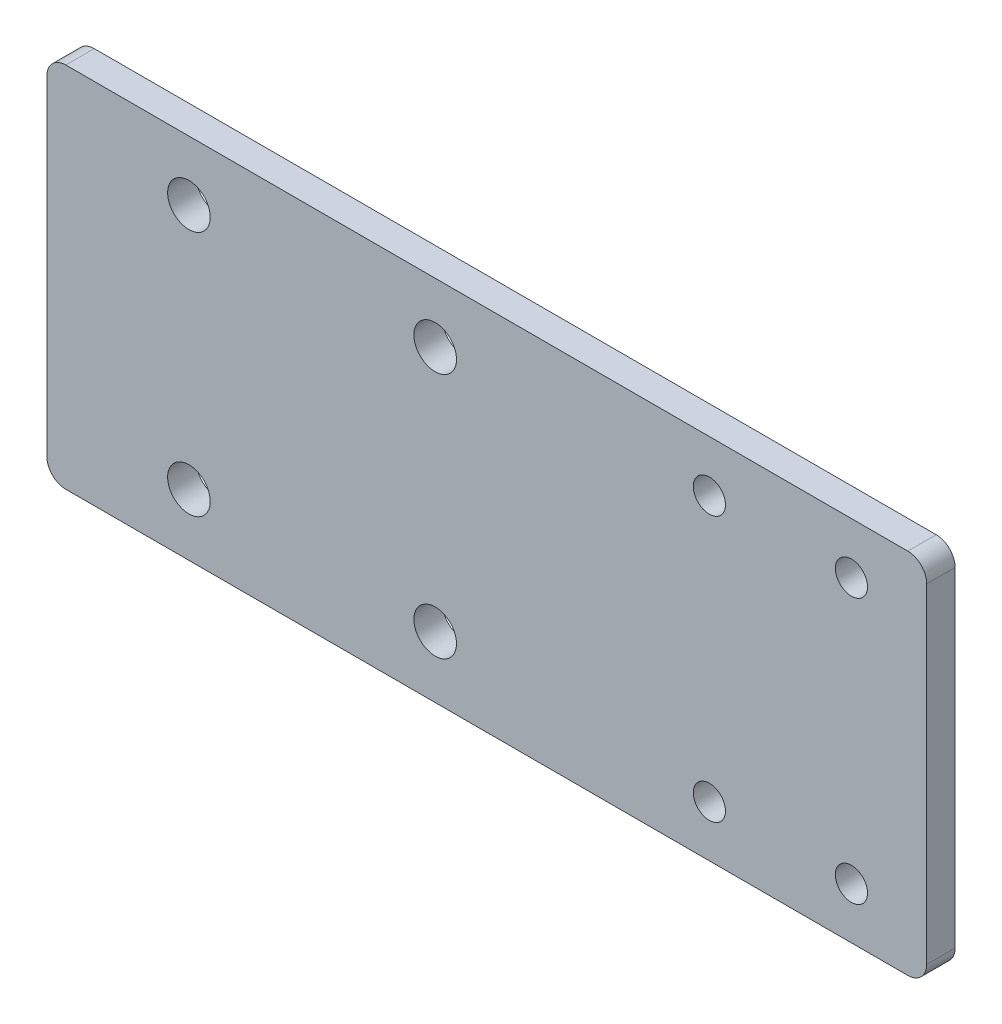
ISO-10303-21;
HEADER;
FILE_DESCRIPTION(('STEP AP214'),'2;1');
FILE_NAME('part.step','',(''),(''),'','','');
FILE_SCHEMA(('AUTOMOTIVE_DESIGN { 1 0 10303 214 1 1 1 1 }'));
ENDSEC;
DATA;
#1=APPLICATION_CONTEXT('core data for automotive mechanical design processes');
#2=APPLICATION_PROTOCOL_DEFINITION('international standard','automotive_design',2000,#1);
#3=PRODUCT_CONTEXT('',#1,'mechanical');
#4=PRODUCT('Part','Part','',(#3));
#5=PRODUCT_RELATED_PRODUCT_CATEGORY('part','',(#4));
#6=PRODUCT_DEFINITION_FORMATION('','',#4);
#7=PRODUCT_DEFINITION_CONTEXT('part definition',#1,'design');
#8=PRODUCT_DEFINITION('design','',#6,#7);
#9=PRODUCT_DEFINITION_SHAPE('','',#8);
#10=(LENGTH_UNIT() NAMED_UNIT(*) SI_UNIT(.MILLI.,.METRE.));
#11=(NAMED_UNIT(*) PLANE_ANGLE_UNIT() SI_UNIT($,.RADIAN.));
#12=(NAMED_UNIT(*) SI_UNIT($,.STERADIAN.) SOLID_ANGLE_UNIT());
#13=UNCERTAINTY_MEASURE_WITH_UNIT(LENGTH_MEASURE(1.E-05),#10,'distance_accuracy_value','');
#14=(GEOMETRIC_REPRESENTATION_CONTEXT(3) GLOBAL_UNCERTAINTY_ASSIGNED_CONTEXT((#13)) GLOBAL_UNIT_ASSIGNED_CONTEXT((#10,
#11,#12)) REPRESENTATION_CONTEXT('',''));
#15=CARTESIAN_POINT('',(0.,0.,0.));
#16=DIRECTION('',(0.,0.,1.));
#17=DIRECTION('',(1.,0.,0.));
#18=AXIS2_PLACEMENT_3D('',#15,#16,#17);
#19=CARTESIAN_POINT('',(-75.45,-17.4,3.));
#20=DIRECTION('',(0.,0.,1.));
#21=DIRECTION('',(1.,0.,0.));
#22=AXIS2_PLACEMENT_3D('',#19,#20,#21);
#23=PLANE('',#22);
#24=CARTESIAN_POINT('',(-7.50000000000001,-14.,3.));
#25=DIRECTION('',(0.,0.,1.));
#26=DIRECTION('',(1.,0.,0.));
#27=AXIS2_PLACEMENT_3D('',#24,#25,#26);
#28=CIRCLE('',#27,1.7);
#29=CARTESIAN_POINT('',(-5.80000000000001,-14.,3.));
#30=VERTEX_POINT('',#29);
#31=EDGE_CURVE('E211',#30,#30,#28,.T.);
#32=ORIENTED_EDGE('',*,*,#31,.F.);
#33=EDGE_LOOP('',(#32));
#34=FACE_BOUND('',#33,.T.);
#35=CARTESIAN_POINT('',(7.49999999999999,14.,3.));
#36=DIRECTION('',(0.,0.,1.));
#37=DIRECTION('',(1.,0.,0.));
#38=AXIS2_PLACEMENT_3D('',#35,#36,#37);
#39=CIRCLE('',#38,1.7);
#40=CARTESIAN_POINT('',(9.19999999999999,14.,3.));
#41=VERTEX_POINT('',#40);
#42=EDGE_CURVE('E199',#41,#41,#39,.T.);
#43=ORIENTED_EDGE('',*,*,#42,.F.);
#44=EDGE_LOOP('',(#43));
#45=FACE_BOUND('',#44,.T.);
#46=CARTESIAN_POINT('',(-36.45,-12.9,3.));
#47=DIRECTION('',(0.,0.,1.));
#48=DIRECTION('',(1.,0.,0.));
#49=AXIS2_PLACEMENT_3D('',#46,#47,#48);
#50=CIRCLE('',#49,2.25);
#51=CARTESIAN_POINT('',(-34.2,-12.9,3.));
#52=VERTEX_POINT('',#51);
#53=EDGE_CURVE('E187',#52,#52,#50,.T.);
#54=ORIENTED_EDGE('',*,*,#53,.F.);
#55=EDGE_LOOP('',(#54));
#56=FACE_BOUND('',#55,.T.);
#57=CARTESIAN_POINT('',(-62.45,13.1,3.));
#58=DIRECTION('',(0.,0.,1.));
#59=DIRECTION('',(1.,0.,0.));
#60=AXIS2_PLACEMENT_3D('',#57,#58,#59);
#61=CIRCLE('',#60,2.25);
#62=CARTESIAN_POINT('',(-60.2,13.1,3.));
#63=VERTEX_POINT('',#62);
#64=EDGE_CURVE('E133',#63,#63,#61,.T.);
#65=ORIENTED_EDGE('',*,*,#64,.F.);
#66=EDGE_LOOP('',(#65));
#67=FACE_BOUND('',#66,.T.);
#68=CARTESIAN_POINT('',(-75.45,-17.4,3.));
#69=DIRECTION('',(0.,0.,1.));
#70=DIRECTION('',(1.,0.,0.));
#71=AXIS2_PLACEMENT_3D('',#68,#69,#70);
#72=CIRCLE('',#71,1.99999999999999);
#73=CARTESIAN_POINT('',(-77.45,-17.4,3.));
#74=VERTEX_POINT('',#73);
#75=CARTESIAN_POINT('',(-75.45,-19.4,3.));
#76=VERTEX_POINT('',#75);
#77=EDGE_CURVE('E144',#74,#76,#72,.T.);
#78=ORIENTED_EDGE('',*,*,#77,.T.);
#79=DIRECTION('',(1.,0.,0.));
#80=VECTOR('',#79,1.);
#81=CARTESIAN_POINT('',(-75.45,-19.4,3.));
#82=LINE('',#81,#80);
#83=CARTESIAN_POINT('',(13.45,-19.4,3.));
#84=VERTEX_POINT('',#83);
#85=EDGE_CURVE('E92',#76,#84,#82,.T.);
#86=ORIENTED_EDGE('',*,*,#85,.T.);
#87=CARTESIAN_POINT('',(13.45,-17.4,3.));
#88=DIRECTION('',(0.,0.,1.));
#89=DIRECTION('',(1.,0.,0.));
#90=AXIS2_PLACEMENT_3D('',#87,#88,#89);
#91=CIRCLE('',#90,2.);
#92=CARTESIAN_POINT('',(15.45,-17.4,3.));
#93=VERTEX_POINT('',#92);
#94=EDGE_CURVE('E159',#84,#93,#91,.T.);
#95=ORIENTED_EDGE('',*,*,#94,.T.);
#96=DIRECTION('',(0.,1.,0.));
#97=VECTOR('',#96,1.);
#98=CARTESIAN_POINT('',(15.45,-17.4,3.));
#99=LINE('',#98,#97);
#100=CARTESIAN_POINT('',(15.45,17.4,3.));
#101=VERTEX_POINT('',#100);
#102=EDGE_CURVE('E172',#93,#101,#99,.T.);
#103=ORIENTED_EDGE('',*,*,#102,.T.);
#104=CARTESIAN_POINT('',(13.45,17.4,3.));
#105=DIRECTION('',(0.,0.,1.));
#106=DIRECTION('',(1.,0.,0.));
#107=AXIS2_PLACEMENT_3D('',#104,#105,#106);
#108=CIRCLE('',#107,2.);
#109=CARTESIAN_POINT('',(13.45,19.4,3.));
#110=VERTEX_POINT('',#109);
#111=EDGE_CURVE('E111',#101,#110,#108,.T.);
#112=ORIENTED_EDGE('',*,*,#111,.T.);
#113=DIRECTION('',(-1.,0.,0.));
#114=VECTOR('',#113,1.);
#115=CARTESIAN_POINT('',(13.45,19.4,3.));
#116=LINE('',#115,#114);
#117=CARTESIAN_POINT('',(-75.45,19.4,3.));
#118=VERTEX_POINT('',#117);
#119=EDGE_CURVE('E105',#110,#118,#116,.T.);
#120=ORIENTED_EDGE('',*,*,#119,.T.);
#121=CARTESIAN_POINT('',(-75.45,17.4,3.));
#122=DIRECTION('',(0.,0.,1.));
#123=DIRECTION('',(1.,0.,0.));
#124=AXIS2_PLACEMENT_3D('',#121,#122,#123);
#125=CIRCLE('',#124,2.);
#126=CARTESIAN_POINT('',(-77.45,17.4,3.));
#127=VERTEX_POINT('',#126);
#128=EDGE_CURVE('E109',#118,#127,#125,.T.);
#129=ORIENTED_EDGE('',*,*,#128,.T.);
#130=DIRECTION('',(0.,-1.,0.));
#131=VECTOR('',#130,1.);
#132=CARTESIAN_POINT('',(-77.45,17.4,3.));
#133=LINE('',#132,#131);
#134=EDGE_CURVE('E49',#127,#74,#133,.T.);
#135=ORIENTED_EDGE('',*,*,#134,.T.);
#136=EDGE_LOOP('',(#78,#86,#95,#103,#112,#120,#129,#135));
#137=FACE_BOUND('',#136,.T.);
#138=CARTESIAN_POINT('',(-36.45,13.1,3.));
#139=DIRECTION('',(0.,0.,1.));
#140=DIRECTION('',(1.,0.,0.));
#141=AXIS2_PLACEMENT_3D('',#138,#139,#140);
#142=CIRCLE('',#141,2.25);
#143=CARTESIAN_POINT('',(-34.2,13.1,3.));
#144=VERTEX_POINT('',#143);
#145=EDGE_CURVE('E181',#144,#144,#142,.T.);
#146=ORIENTED_EDGE('',*,*,#145,.F.);
#147=EDGE_LOOP('',(#146));
#148=FACE_BOUND('',#147,.T.);
#149=CARTESIAN_POINT('',(-62.45,-12.9,3.));
#150=DIRECTION('',(0.,0.,1.));
#151=DIRECTION('',(1.,0.,0.));
#152=AXIS2_PLACEMENT_3D('',#149,#150,#151);
#153=CIRCLE('',#152,2.25);
#154=CARTESIAN_POINT('',(-60.2,-12.9,3.));
#155=VERTEX_POINT('',#154);
#156=EDGE_CURVE('E193',#155,#155,#153,.T.);
#157=ORIENTED_EDGE('',*,*,#156,.F.);
#158=EDGE_LOOP('',(#157));
#159=FACE_BOUND('',#158,.T.);
#160=CARTESIAN_POINT('',(-7.50000000000001,14.,3.));
#161=DIRECTION('',(0.,0.,1.));
#162=DIRECTION('',(1.,0.,0.));
#163=AXIS2_PLACEMENT_3D('',#160,#161,#162);
#164=CIRCLE('',#163,1.7);
#165=CARTESIAN_POINT('',(-5.80000000000001,14.,3.));
#166=VERTEX_POINT('',#165);
#167=EDGE_CURVE('E205',#166,#166,#164,.T.);
#168=ORIENTED_EDGE('',*,*,#167,.F.);
#169=EDGE_LOOP('',(#168));
#170=FACE_BOUND('',#169,.T.);
#171=CARTESIAN_POINT('',(7.49999999999999,-14.,3.));
#172=DIRECTION('',(0.,0.,1.));
#173=DIRECTION('',(1.,0.,0.));
#174=AXIS2_PLACEMENT_3D('',#171,#172,#173);
#175=CIRCLE('',#174,1.7);
#176=CARTESIAN_POINT('',(9.19999999999999,-14.,3.));
#177=VERTEX_POINT('',#176);
#178=EDGE_CURVE('E217',#177,#177,#175,.T.);
#179=ORIENTED_EDGE('',*,*,#178,.F.);
#180=EDGE_LOOP('',(#179));
#181=FACE_BOUND('',#180,.T.);
#182=ADVANCED_FACE('F32',(#34,#45,#56,#67,#137,#148,#159,#170,#181),#23,.T.);
#183=CARTESIAN_POINT('',(-75.45,-17.4,0.));
#184=DIRECTION('',(0.,0.,1.));
#185=DIRECTION('',(1.,0.,0.));
#186=AXIS2_PLACEMENT_3D('',#183,#184,#185);
#187=PLANE('',#186);
#188=CARTESIAN_POINT('',(-75.45,-17.4,0.));
#189=DIRECTION('',(0.,0.,1.));
#190=DIRECTION('',(1.,0.,0.));
#191=AXIS2_PLACEMENT_3D('',#188,#189,#190);
#192=CIRCLE('',#191,1.99999999999999);
#193=CARTESIAN_POINT('',(-77.45,-17.4,0.));
#194=VERTEX_POINT('',#193);
#195=CARTESIAN_POINT('',(-75.45,-19.4,0.));
#196=VERTEX_POINT('',#195);
#197=EDGE_CURVE('E129',#194,#196,#192,.T.);
#198=ORIENTED_EDGE('',*,*,#197,.F.);
#199=DIRECTION('',(0.,-1.,0.));
#200=VECTOR('',#199,1.);
#201=CARTESIAN_POINT('',(-77.45,17.4,0.));
#202=LINE('',#201,#200);
#203=CARTESIAN_POINT('',(-77.45,17.4,0.));
#204=VERTEX_POINT('',#203);
#205=EDGE_CURVE('E84',#204,#194,#202,.T.);
#206=ORIENTED_EDGE('',*,*,#205,.F.);
#207=CARTESIAN_POINT('',(-75.45,17.4,0.));
#208=DIRECTION('',(0.,0.,1.));
#209=DIRECTION('',(1.,0.,0.));
#210=AXIS2_PLACEMENT_3D('',#207,#208,#209);
#211=CIRCLE('',#210,2.);
#212=CARTESIAN_POINT('',(-75.45,19.4,0.));
#213=VERTEX_POINT('',#212);
#214=EDGE_CURVE('E78',#213,#204,#211,.T.);
#215=ORIENTED_EDGE('',*,*,#214,.F.);
#216=DIRECTION('',(-1.,0.,0.));
#217=VECTOR('',#216,1.);
#218=CARTESIAN_POINT('',(13.45,19.4,0.));
#219=LINE('',#218,#217);
#220=CARTESIAN_POINT('',(13.45,19.4,0.));
#221=VERTEX_POINT('',#220);
#222=EDGE_CURVE('E119',#221,#213,#219,.T.);
#223=ORIENTED_EDGE('',*,*,#222,.F.);
#224=CARTESIAN_POINT('',(13.45,17.4,0.));
#225=DIRECTION('',(0.,0.,1.));
#226=DIRECTION('',(1.,0.,0.));
#227=AXIS2_PLACEMENT_3D('',#224,#225,#226);
#228=CIRCLE('',#227,2.);
#229=CARTESIAN_POINT('',(15.45,17.4,0.));
#230=VERTEX_POINT('',#229);
#231=EDGE_CURVE('E139',#230,#221,#228,.T.);
#232=ORIENTED_EDGE('',*,*,#231,.F.);
#233=DIRECTION('',(0.,1.,0.));
#234=VECTOR('',#233,1.);
#235=CARTESIAN_POINT('',(15.45,-17.4,0.));
#236=LINE('',#235,#234);
#237=CARTESIAN_POINT('',(15.45,-17.4,0.));
#238=VERTEX_POINT('',#237);
#239=EDGE_CURVE('E137',#238,#230,#236,.T.);
#240=ORIENTED_EDGE('',*,*,#239,.F.);
#241=CARTESIAN_POINT('',(13.45,-17.4,0.));
#242=DIRECTION('',(0.,0.,1.));
#243=DIRECTION('',(1.,0.,0.));
#244=AXIS2_PLACEMENT_3D('',#241,#242,#243);
#245=CIRCLE('',#244,2.);
#246=CARTESIAN_POINT('',(13.45,-19.4,0.));
#247=VERTEX_POINT('',#246);
#248=EDGE_CURVE('E135',#247,#238,#245,.T.);
#249=ORIENTED_EDGE('',*,*,#248,.F.);
#250=DIRECTION('',(1.,0.,0.));
#251=VECTOR('',#250,1.);
#252=CARTESIAN_POINT('',(-75.45,-19.4,0.));
#253=LINE('',#252,#251);
#254=EDGE_CURVE('E132',#196,#247,#253,.T.);
#255=ORIENTED_EDGE('',*,*,#254,.F.);
#256=EDGE_LOOP('',(#198,#206,#215,#223,#232,#240,#249,#255));
#257=FACE_BOUND('',#256,.T.);
#258=CARTESIAN_POINT('',(-62.45,13.1,0.));
#259=DIRECTION('',(0.,0.,1.));
#260=DIRECTION('',(1.,0.,0.));
#261=AXIS2_PLACEMENT_3D('',#258,#259,#260);
#262=CIRCLE('',#261,2.25);
#263=CARTESIAN_POINT('',(-60.2,13.1,0.));
#264=VERTEX_POINT('',#263);
#265=EDGE_CURVE('E178',#264,#264,#262,.T.);
#266=ORIENTED_EDGE('',*,*,#265,.T.);
#267=EDGE_LOOP('',(#266));
#268=FACE_BOUND('',#267,.T.);
#269=CARTESIAN_POINT('',(-36.45,13.1,0.));
#270=DIRECTION('',(0.,0.,1.));
#271=DIRECTION('',(1.,0.,0.));
#272=AXIS2_PLACEMENT_3D('',#269,#270,#271);
#273=CIRCLE('',#272,2.25);
#274=CARTESIAN_POINT('',(-34.2,13.1,0.));
#275=VERTEX_POINT('',#274);
#276=EDGE_CURVE('E184',#275,#275,#273,.T.);
#277=ORIENTED_EDGE('',*,*,#276,.T.);
#278=EDGE_LOOP('',(#277));
#279=FACE_BOUND('',#278,.T.);
#280=CARTESIAN_POINT('',(-36.45,-12.9,0.));
#281=DIRECTION('',(0.,0.,1.));
#282=DIRECTION('',(1.,0.,0.));
#283=AXIS2_PLACEMENT_3D('',#280,#281,#282);
#284=CIRCLE('',#283,2.25);
#285=CARTESIAN_POINT('',(-34.2,-12.9,0.));
#286=VERTEX_POINT('',#285);
#287=EDGE_CURVE('E190',#286,#286,#284,.T.);
#288=ORIENTED_EDGE('',*,*,#287,.T.);
#289=EDGE_LOOP('',(#288));
#290=FACE_BOUND('',#289,.T.);
#291=CARTESIAN_POINT('',(-62.45,-12.9,0.));
#292=DIRECTION('',(0.,0.,1.));
#293=DIRECTION('',(1.,0.,0.));
#294=AXIS2_PLACEMENT_3D('',#291,#292,#293);
#295=CIRCLE('',#294,2.25);
#296=CARTESIAN_POINT('',(-60.2,-12.9,0.));
#297=VERTEX_POINT('',#296);
#298=EDGE_CURVE('E196',#297,#297,#295,.T.);
#299=ORIENTED_EDGE('',*,*,#298,.T.);
#300=EDGE_LOOP('',(#299));
#301=FACE_BOUND('',#300,.T.);
#302=CARTESIAN_POINT('',(7.49999999999999,14.,0.));
#303=DIRECTION('',(0.,0.,1.));
#304=DIRECTION('',(1.,0.,0.));
#305=AXIS2_PLACEMENT_3D('',#302,#303,#304);
#306=CIRCLE('',#305,1.7);
#307=CARTESIAN_POINT('',(9.19999999999999,14.,0.));
#308=VERTEX_POINT('',#307);
#309=EDGE_CURVE('E202',#308,#308,#306,.T.);
#310=ORIENTED_EDGE('',*,*,#309,.T.);
#311=EDGE_LOOP('',(#310));
#312=FACE_BOUND('',#311,.T.);
#313=CARTESIAN_POINT('',(-7.50000000000001,14.,0.));
#314=DIRECTION('',(0.,0.,1.));
#315=DIRECTION('',(1.,0.,0.));
#316=AXIS2_PLACEMENT_3D('',#313,#314,#315);
#317=CIRCLE('',#316,1.7);
#318=CARTESIAN_POINT('',(-5.80000000000001,14.,0.));
#319=VERTEX_POINT('',#318);
#320=EDGE_CURVE('E208',#319,#319,#317,.T.);
#321=ORIENTED_EDGE('',*,*,#320,.T.);
#322=EDGE_LOOP('',(#321));
#323=FACE_BOUND('',#322,.T.);
#324=CARTESIAN_POINT('',(-7.50000000000001,-14.,0.));
#325=DIRECTION('',(0.,0.,1.));
#326=DIRECTION('',(1.,0.,0.));
#327=AXIS2_PLACEMENT_3D('',#324,#325,#326);
#328=CIRCLE('',#327,1.7);
#329=CARTESIAN_POINT('',(-5.80000000000001,-14.,0.));
#330=VERTEX_POINT('',#329);
#331=EDGE_CURVE('E214',#330,#330,#328,.T.);
#332=ORIENTED_EDGE('',*,*,#331,.T.);
#333=EDGE_LOOP('',(#332));
#334=FACE_BOUND('',#333,.T.);
#335=CARTESIAN_POINT('',(7.49999999999999,-14.,0.));
#336=DIRECTION('',(0.,0.,1.));
#337=DIRECTION('',(1.,0.,0.));
#338=AXIS2_PLACEMENT_3D('',#335,#336,#337);
#339=CIRCLE('',#338,1.7);
#340=CARTESIAN_POINT('',(9.19999999999999,-14.,0.));
#341=VERTEX_POINT('',#340);
#342=EDGE_CURVE('E220',#341,#341,#339,.T.);
#343=ORIENTED_EDGE('',*,*,#342,.T.);
#344=EDGE_LOOP('',(#343));
#345=FACE_BOUND('',#344,.T.);
#346=ADVANCED_FACE('F163',(#257,#268,#279,#290,#301,#312,#323,#334,#345),#187,.F.);
#347=CARTESIAN_POINT('',(-75.45,-17.4,3.));
#348=DIRECTION('',(0.,0.,-1.));
#349=DIRECTION('',(-1.,0.,0.));
#350=AXIS2_PLACEMENT_3D('',#347,#348,#349);
#351=CYLINDRICAL_SURFACE('',#350,1.99999999999999);
#352=ORIENTED_EDGE('',*,*,#197,.T.);
#353=DIRECTION('',(0.,0.,-1.));
#354=VECTOR('',#353,1.);
#355=CARTESIAN_POINT('',(-75.45,-19.4,3.));
#356=LINE('',#355,#354);
#357=EDGE_CURVE('E11',#76,#196,#356,.T.);
#358=ORIENTED_EDGE('',*,*,#357,.F.);
#359=ORIENTED_EDGE('',*,*,#77,.F.);
#360=DIRECTION('',(0.,0.,-1.));
#361=VECTOR('',#360,1.);
#362=CARTESIAN_POINT('',(-77.45,-17.4,3.));
#363=LINE('',#362,#361);
#364=EDGE_CURVE('E125',#74,#194,#363,.T.);
#365=ORIENTED_EDGE('',*,*,#364,.T.);
#366=EDGE_LOOP('',(#352,#358,#359,#365));
#367=FACE_BOUND('',#366,.T.);
#368=ADVANCED_FACE('F34',(#367),#351,.T.);
#369=CARTESIAN_POINT('',(-75.45,-19.4,3.));
#370=DIRECTION('',(0.,1.,0.));
#371=DIRECTION('',(0.,0.,1.));
#372=AXIS2_PLACEMENT_3D('',#369,#370,#371);
#373=PLANE('',#372);
#374=ORIENTED_EDGE('',*,*,#254,.T.);
#375=DIRECTION('',(0.,0.,-1.));
#376=VECTOR('',#375,1.);
#377=CARTESIAN_POINT('',(13.45,-19.4,3.));
#378=LINE('',#377,#376);
#379=EDGE_CURVE('E41',#84,#247,#378,.T.);
#380=ORIENTED_EDGE('',*,*,#379,.F.);
#381=ORIENTED_EDGE('',*,*,#85,.F.);
#382=ORIENTED_EDGE('',*,*,#357,.T.);
#383=EDGE_LOOP('',(#374,#380,#381,#382));
#384=FACE_BOUND('',#383,.T.);
#385=ADVANCED_FACE('F254',(#384),#373,.F.);
#386=CARTESIAN_POINT('',(13.45,-17.4,3.));
#387=DIRECTION('',(0.,0.,-1.));
#388=DIRECTION('',(-1.,0.,0.));
#389=AXIS2_PLACEMENT_3D('',#386,#387,#388);
#390=CYLINDRICAL_SURFACE('',#389,2.);
#391=ORIENTED_EDGE('',*,*,#248,.T.);
#392=DIRECTION('',(0.,0.,-1.));
#393=VECTOR('',#392,1.);
#394=CARTESIAN_POINT('',(15.45,-17.4,3.));
#395=LINE('',#394,#393);
#396=EDGE_CURVE('E151',#93,#238,#395,.T.);
#397=ORIENTED_EDGE('',*,*,#396,.F.);
#398=ORIENTED_EDGE('',*,*,#94,.F.);
#399=ORIENTED_EDGE('',*,*,#379,.T.);
#400=EDGE_LOOP('',(#391,#397,#398,#399));
#401=FACE_BOUND('',#400,.T.);
#402=ADVANCED_FACE('F157',(#401),#390,.T.);
#403=CARTESIAN_POINT('',(15.45,-17.4,3.));
#404=DIRECTION('',(-1.,0.,0.));
#405=DIRECTION('',(0.,-1.,0.));
#406=AXIS2_PLACEMENT_3D('',#403,#404,#405);
#407=PLANE('',#406);
#408=ORIENTED_EDGE('',*,*,#239,.T.);
#409=DIRECTION('',(0.,0.,-1.));
#410=VECTOR('',#409,1.);
#411=CARTESIAN_POINT('',(15.45,17.4,3.));
#412=LINE('',#411,#410);
#413=EDGE_CURVE('E148',#101,#230,#412,.T.);
#414=ORIENTED_EDGE('',*,*,#413,.F.);
#415=ORIENTED_EDGE('',*,*,#102,.F.);
#416=ORIENTED_EDGE('',*,*,#396,.T.);
#417=EDGE_LOOP('',(#408,#414,#415,#416));
#418=FACE_BOUND('',#417,.T.);
#419=ADVANCED_FACE('F168',(#418),#407,.F.);
#420=CARTESIAN_POINT('',(13.45,17.4,3.));
#421=DIRECTION('',(0.,0.,-1.));
#422=DIRECTION('',(-1.,0.,0.));
#423=AXIS2_PLACEMENT_3D('',#420,#421,#422);
#424=CYLINDRICAL_SURFACE('',#423,2.);
#425=ORIENTED_EDGE('',*,*,#231,.T.);
#426=DIRECTION('',(0.,0.,-1.));
#427=VECTOR('',#426,1.);
#428=CARTESIAN_POINT('',(13.45,19.4,3.));
#429=LINE('',#428,#427);
#430=EDGE_CURVE('E120',#110,#221,#429,.T.);
#431=ORIENTED_EDGE('',*,*,#430,.F.);
#432=ORIENTED_EDGE('',*,*,#111,.F.);
#433=ORIENTED_EDGE('',*,*,#413,.T.);
#434=EDGE_LOOP('',(#425,#431,#432,#433));
#435=FACE_BOUND('',#434,.T.);
#436=ADVANCED_FACE('F171',(#435),#424,.T.);
#437=CARTESIAN_POINT('',(13.45,19.4,3.));
#438=DIRECTION('',(0.,-1.,0.));
#439=DIRECTION('',(1.,0.,0.));
#440=AXIS2_PLACEMENT_3D('',#437,#438,#439);
#441=PLANE('',#440);
#442=ORIENTED_EDGE('',*,*,#222,.T.);
#443=DIRECTION('',(0.,0.,-1.));
#444=VECTOR('',#443,1.);
#445=CARTESIAN_POINT('',(-75.45,19.4,3.));
#446=LINE('',#445,#444);
#447=EDGE_CURVE('E116',#118,#213,#446,.T.);
#448=ORIENTED_EDGE('',*,*,#447,.F.);
#449=ORIENTED_EDGE('',*,*,#119,.F.);
#450=ORIENTED_EDGE('',*,*,#430,.T.);
#451=EDGE_LOOP('',(#442,#448,#449,#450));
#452=FACE_BOUND('',#451,.T.);
#453=ADVANCED_FACE('F117',(#452),#441,.F.);
#454=CARTESIAN_POINT('',(-75.45,17.4,3.));
#455=DIRECTION('',(0.,0.,-1.));
#456=DIRECTION('',(-1.,0.,0.));
#457=AXIS2_PLACEMENT_3D('',#454,#455,#456);
#458=CYLINDRICAL_SURFACE('',#457,2.);
#459=ORIENTED_EDGE('',*,*,#214,.T.);
#460=DIRECTION('',(0.,0.,-1.));
#461=VECTOR('',#460,1.);
#462=CARTESIAN_POINT('',(-77.45,17.4,3.));
#463=LINE('',#462,#461);
#464=EDGE_CURVE('E121',#127,#204,#463,.T.);
#465=ORIENTED_EDGE('',*,*,#464,.F.);
#466=ORIENTED_EDGE('',*,*,#128,.F.);
#467=ORIENTED_EDGE('',*,*,#447,.T.);
#468=EDGE_LOOP('',(#459,#465,#466,#467));
#469=FACE_BOUND('',#468,.T.);
#470=ADVANCED_FACE('F123',(#469),#458,.T.);
#471=CARTESIAN_POINT('',(-77.45,17.4,3.));
#472=DIRECTION('',(1.,0.,0.));
#473=DIRECTION('',(0.,0.,-1.));
#474=AXIS2_PLACEMENT_3D('',#471,#472,#473);
#475=PLANE('',#474);
#476=ORIENTED_EDGE('',*,*,#205,.T.);
#477=ORIENTED_EDGE('',*,*,#364,.F.);
#478=ORIENTED_EDGE('',*,*,#134,.F.);
#479=ORIENTED_EDGE('',*,*,#464,.T.);
#480=EDGE_LOOP('',(#476,#477,#478,#479));
#481=FACE_BOUND('',#480,.T.);
#482=ADVANCED_FACE('F242',(#481),#475,.F.);
#483=CARTESIAN_POINT('',(-62.45,13.1,3.));
#484=DIRECTION('',(0.,0.,-1.));
#485=DIRECTION('',(-1.,0.,0.));
#486=AXIS2_PLACEMENT_3D('',#483,#484,#485);
#487=CYLINDRICAL_SURFACE('',#486,2.25);
#488=ORIENTED_EDGE('',*,*,#64,.T.);
#489=EDGE_LOOP('',(#488));
#490=FACE_BOUND('',#489,.T.);
#491=ORIENTED_EDGE('',*,*,#265,.F.);
#492=EDGE_LOOP('',(#491));
#493=FACE_BOUND('',#492,.T.);
#494=ADVANCED_FACE('F239',(#490,#493),#487,.F.);
#495=CARTESIAN_POINT('',(-36.45,13.1,3.));
#496=DIRECTION('',(0.,0.,-1.));
#497=DIRECTION('',(-1.,0.,0.));
#498=AXIS2_PLACEMENT_3D('',#495,#496,#497);
#499=CYLINDRICAL_SURFACE('',#498,2.25);
#500=ORIENTED_EDGE('',*,*,#145,.T.);
#501=EDGE_LOOP('',(#500));
#502=FACE_BOUND('',#501,.T.);
#503=ORIENTED_EDGE('',*,*,#276,.F.);
#504=EDGE_LOOP('',(#503));
#505=FACE_BOUND('',#504,.T.);
#506=ADVANCED_FACE('F318',(#502,#505),#499,.F.);
#507=CARTESIAN_POINT('',(-36.45,-12.9,3.));
#508=DIRECTION('',(0.,0.,-1.));
#509=DIRECTION('',(-1.,0.,0.));
#510=AXIS2_PLACEMENT_3D('',#507,#508,#509);
#511=CYLINDRICAL_SURFACE('',#510,2.25);
#512=ORIENTED_EDGE('',*,*,#53,.T.);
#513=EDGE_LOOP('',(#512));
#514=FACE_BOUND('',#513,.T.);
#515=ORIENTED_EDGE('',*,*,#287,.F.);
#516=EDGE_LOOP('',(#515));
#517=FACE_BOUND('',#516,.T.);
#518=ADVANCED_FACE('F326',(#514,#517),#511,.F.);
#519=CARTESIAN_POINT('',(-62.45,-12.9,3.));
#520=DIRECTION('',(0.,0.,-1.));
#521=DIRECTION('',(-1.,0.,0.));
#522=AXIS2_PLACEMENT_3D('',#519,#520,#521);
#523=CYLINDRICAL_SURFACE('',#522,2.25);
#524=ORIENTED_EDGE('',*,*,#156,.T.);
#525=EDGE_LOOP('',(#524));
#526=FACE_BOUND('',#525,.T.);
#527=ORIENTED_EDGE('',*,*,#298,.F.);
#528=EDGE_LOOP('',(#527));
#529=FACE_BOUND('',#528,.T.);
#530=ADVANCED_FACE('F334',(#526,#529),#523,.F.);
#531=CARTESIAN_POINT('',(7.49999999999999,14.,3.));
#532=DIRECTION('',(0.,0.,-1.));
#533=DIRECTION('',(-1.,0.,0.));
#534=AXIS2_PLACEMENT_3D('',#531,#532,#533);
#535=CYLINDRICAL_SURFACE('',#534,1.7);
#536=ORIENTED_EDGE('',*,*,#42,.T.);
#537=EDGE_LOOP('',(#536));
#538=FACE_BOUND('',#537,.T.);
#539=ORIENTED_EDGE('',*,*,#309,.F.);
#540=EDGE_LOOP('',(#539));
#541=FACE_BOUND('',#540,.T.);
#542=ADVANCED_FACE('F343',(#538,#541),#535,.F.);
#543=CARTESIAN_POINT('',(-7.50000000000001,14.,3.));
#544=DIRECTION('',(0.,0.,-1.));
#545=DIRECTION('',(-1.,0.,0.));
#546=AXIS2_PLACEMENT_3D('',#543,#544,#545);
#547=CYLINDRICAL_SURFACE('',#546,1.7);
#548=ORIENTED_EDGE('',*,*,#167,.T.);
#549=EDGE_LOOP('',(#548));
#550=FACE_BOUND('',#549,.T.);
#551=ORIENTED_EDGE('',*,*,#320,.F.);
#552=EDGE_LOOP('',(#551));
#553=FACE_BOUND('',#552,.T.);
#554=ADVANCED_FACE('F352',(#550,#553),#547,.F.);
#555=CARTESIAN_POINT('',(-7.50000000000001,-14.,3.));
#556=DIRECTION('',(0.,0.,-1.));
#557=DIRECTION('',(-1.,0.,0.));
#558=AXIS2_PLACEMENT_3D('',#555,#556,#557);
#559=CYLINDRICAL_SURFACE('',#558,1.7);
#560=ORIENTED_EDGE('',*,*,#31,.T.);
#561=EDGE_LOOP('',(#560));
#562=FACE_BOUND('',#561,.T.);
#563=ORIENTED_EDGE('',*,*,#331,.F.);
#564=EDGE_LOOP('',(#563));
#565=FACE_BOUND('',#564,.T.);
#566=ADVANCED_FACE('F361',(#562,#565),#559,.F.);
#567=CARTESIAN_POINT('',(7.49999999999999,-14.,3.));
#568=DIRECTION('',(0.,0.,-1.));
#569=DIRECTION('',(-1.,0.,0.));
#570=AXIS2_PLACEMENT_3D('',#567,#568,#569);
#571=CYLINDRICAL_SURFACE('',#570,1.7);
#572=ORIENTED_EDGE('',*,*,#178,.T.);
#573=EDGE_LOOP('',(#572));
#574=FACE_BOUND('',#573,.T.);
#575=ORIENTED_EDGE('',*,*,#342,.F.);
#576=EDGE_LOOP('',(#575));
#577=FACE_BOUND('',#576,.T.);
#578=ADVANCED_FACE('F226',(#574,#577),#571,.F.);
#579=CLOSED_SHELL('',(#182,#346,#368,#385,#402,#419,#436,#453,#470,#482,#494,#506,#518,#530,
#542,#554,#566,#578));
#580=MANIFOLD_SOLID_BREP('B2',#579);
#581=ADVANCED_BREP_SHAPE_REPRESENTATION('',(#18,#580),#14);
#582=SHAPE_DEFINITION_REPRESENTATION(#9,#581);
ENDSEC;
END-ISO-10303-21;
